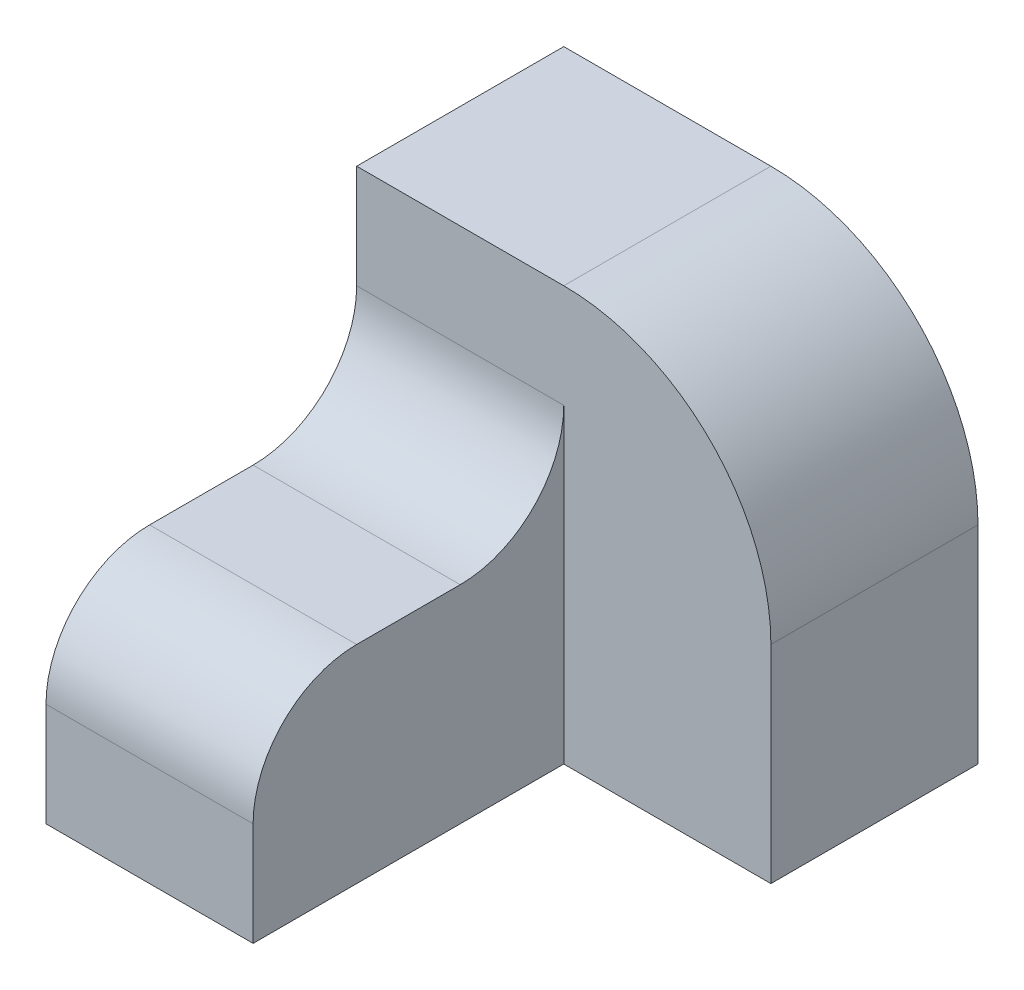
ISO-10303-21;
HEADER;
FILE_DESCRIPTION(('STEP AP214'),'2;1');
FILE_NAME('part.step','',(''),(''),'','','');
FILE_SCHEMA(('AUTOMOTIVE_DESIGN { 1 0 10303 214 1 1 1 1 }'));
ENDSEC;
DATA;
#1=APPLICATION_CONTEXT('core data for automotive mechanical design processes');
#2=APPLICATION_PROTOCOL_DEFINITION('international standard','automotive_design',2000,#1);
#3=PRODUCT_CONTEXT('',#1,'mechanical');
#4=PRODUCT('Part','Part','',(#3));
#5=PRODUCT_RELATED_PRODUCT_CATEGORY('part','',(#4));
#6=PRODUCT_DEFINITION_FORMATION('','',#4);
#7=PRODUCT_DEFINITION_CONTEXT('part definition',#1,'design');
#8=PRODUCT_DEFINITION('design','',#6,#7);
#9=PRODUCT_DEFINITION_SHAPE('','',#8);
#10=(LENGTH_UNIT() NAMED_UNIT(*) SI_UNIT(.MILLI.,.METRE.));
#11=(NAMED_UNIT(*) PLANE_ANGLE_UNIT() SI_UNIT($,.RADIAN.));
#12=(NAMED_UNIT(*) SI_UNIT($,.STERADIAN.) SOLID_ANGLE_UNIT());
#13=UNCERTAINTY_MEASURE_WITH_UNIT(LENGTH_MEASURE(1.E-05),#10,'distance_accuracy_value','');
#14=(GEOMETRIC_REPRESENTATION_CONTEXT(3) GLOBAL_UNCERTAINTY_ASSIGNED_CONTEXT((#13)) GLOBAL_UNIT_ASSIGNED_CONTEXT((#10,
#11,#12)) REPRESENTATION_CONTEXT('',''));
#15=CARTESIAN_POINT('',(0.,0.,0.));
#16=DIRECTION('',(0.,0.,1.));
#17=DIRECTION('',(1.,0.,0.));
#18=AXIS2_PLACEMENT_3D('',#15,#16,#17);
#19=CARTESIAN_POINT('',(0.,20.,0.));
#20=DIRECTION('',(0.,0.,-1.));
#21=DIRECTION('',(-1.,0.,0.));
#22=AXIS2_PLACEMENT_3D('',#19,#20,#21);
#23=PLANE('',#22);
#24=DIRECTION('',(0.,-1.,0.));
#25=VECTOR('',#24,1.);
#26=CARTESIAN_POINT('',(20.,20.,0.));
#27=LINE('',#26,#25);
#28=CARTESIAN_POINT('',(20.,10.,0.));
#29=VERTEX_POINT('',#28);
#30=CARTESIAN_POINT('',(20.,0.,0.));
#31=VERTEX_POINT('',#30);
#32=EDGE_CURVE('E166',#29,#31,#27,.T.);
#33=ORIENTED_EDGE('',*,*,#32,.F.);
#34=CARTESIAN_POINT('',(10.,10.,0.));
#35=DIRECTION('',(0.,0.,-1.));
#36=DIRECTION('',(-1.,0.,0.));
#37=AXIS2_PLACEMENT_3D('',#34,#35,#36);
#38=CIRCLE('',#37,10.);
#39=CARTESIAN_POINT('',(10.,20.,0.));
#40=VERTEX_POINT('',#39);
#41=EDGE_CURVE('E11',#29,#40,#38,.F.);
#42=ORIENTED_EDGE('',*,*,#41,.T.);
#43=DIRECTION('',(1.,0.,0.));
#44=VECTOR('',#43,1.);
#45=CARTESIAN_POINT('',(0.,20.,0.));
#46=LINE('',#45,#44);
#47=CARTESIAN_POINT('',(0.,20.,0.));
#48=VERTEX_POINT('',#47);
#49=EDGE_CURVE('E151',#48,#40,#46,.T.);
#50=ORIENTED_EDGE('',*,*,#49,.F.);
#51=DIRECTION('',(0.,-1.,0.));
#52=VECTOR('',#51,1.);
#53=CARTESIAN_POINT('',(0.,20.,0.));
#54=LINE('',#53,#52);
#55=CARTESIAN_POINT('',(0.,15.,0.));
#56=VERTEX_POINT('',#55);
#57=EDGE_CURVE('E168',#48,#56,#54,.T.);
#58=ORIENTED_EDGE('',*,*,#57,.T.);
#59=DIRECTION('',(-1.,0.,0.));
#60=VECTOR('',#59,1.);
#61=CARTESIAN_POINT('',(10.,15.,0.));
#62=LINE('',#61,#60);
#63=CARTESIAN_POINT('',(10.,15.,0.));
#64=VERTEX_POINT('',#63);
#65=EDGE_CURVE('E181',#56,#64,#62,.F.);
#66=ORIENTED_EDGE('',*,*,#65,.T.);
#67=DIRECTION('',(0.,1.,0.));
#68=VECTOR('',#67,1.);
#69=CARTESIAN_POINT('',(10.,0.,0.));
#70=LINE('',#69,#68);
#71=CARTESIAN_POINT('',(10.,0.,0.));
#72=VERTEX_POINT('',#71);
#73=EDGE_CURVE('E118',#72,#64,#70,.T.);
#74=ORIENTED_EDGE('',*,*,#73,.F.);
#75=DIRECTION('',(1.,0.,0.));
#76=VECTOR('',#75,1.);
#77=CARTESIAN_POINT('',(0.,0.,0.));
#78=LINE('',#77,#76);
#79=EDGE_CURVE('E129',#72,#31,#78,.T.);
#80=ORIENTED_EDGE('',*,*,#79,.T.);
#81=EDGE_LOOP('',(#33,#42,#50,#58,#66,#74,#80));
#82=FACE_BOUND('',#81,.T.);
#83=ADVANCED_FACE('F33',(#82),#23,.F.);
#84=CARTESIAN_POINT('',(0.,20.,0.));
#85=DIRECTION('',(1.,0.,0.));
#86=DIRECTION('',(0.,0.,-1.));
#87=AXIS2_PLACEMENT_3D('',#84,#85,#86);
#88=PLANE('',#87);
#89=DIRECTION('',(0.,-1.,0.));
#90=VECTOR('',#89,1.);
#91=CARTESIAN_POINT('',(0.,0.,15.));
#92=LINE('',#91,#90);
#93=CARTESIAN_POINT('',(0.,5.,15.));
#94=VERTEX_POINT('',#93);
#95=CARTESIAN_POINT('',(0.,0.,15.));
#96=VERTEX_POINT('',#95);
#97=EDGE_CURVE('E108',#94,#96,#92,.T.);
#98=ORIENTED_EDGE('',*,*,#97,.F.);
#99=CARTESIAN_POINT('',(0.,5.,10.));
#100=DIRECTION('',(1.,0.,0.));
#101=DIRECTION('',(0.,0.,-1.));
#102=AXIS2_PLACEMENT_3D('',#99,#100,#101);
#103=CIRCLE('',#102,5.);
#104=CARTESIAN_POINT('',(0.,10.,10.));
#105=VERTEX_POINT('',#104);
#106=EDGE_CURVE('E172',#94,#105,#103,.F.);
#107=ORIENTED_EDGE('',*,*,#106,.T.);
#108=DIRECTION('',(0.,0.,-1.));
#109=VECTOR('',#108,1.);
#110=CARTESIAN_POINT('',(0.,10.,15.));
#111=LINE('',#110,#109);
#112=CARTESIAN_POINT('',(0.,10.,5.));
#113=VERTEX_POINT('',#112);
#114=EDGE_CURVE('E138',#105,#113,#111,.T.);
#115=ORIENTED_EDGE('',*,*,#114,.T.);
#116=CARTESIAN_POINT('',(0.,15.,5.));
#117=DIRECTION('',(1.,0.,0.));
#118=DIRECTION('',(0.,0.,-1.));
#119=AXIS2_PLACEMENT_3D('',#116,#117,#118);
#120=CIRCLE('',#119,5.);
#121=EDGE_CURVE('E184',#113,#56,#120,.T.);
#122=ORIENTED_EDGE('',*,*,#121,.T.);
#123=ORIENTED_EDGE('',*,*,#57,.F.);
#124=DIRECTION('',(0.,0.,1.));
#125=VECTOR('',#124,1.);
#126=CARTESIAN_POINT('',(0.,20.,0.));
#127=LINE('',#126,#125);
#128=CARTESIAN_POINT('',(0.,20.,-10.));
#129=VERTEX_POINT('',#128);
#130=EDGE_CURVE('E148',#129,#48,#127,.T.);
#131=ORIENTED_EDGE('',*,*,#130,.F.);
#132=DIRECTION('',(0.,-1.,0.));
#133=VECTOR('',#132,1.);
#134=CARTESIAN_POINT('',(0.,20.,-10.));
#135=LINE('',#134,#133);
#136=CARTESIAN_POINT('',(0.,0.,-10.));
#137=VERTEX_POINT('',#136);
#138=EDGE_CURVE('E126',#129,#137,#135,.T.);
#139=ORIENTED_EDGE('',*,*,#138,.T.);
#140=DIRECTION('',(0.,0.,1.));
#141=VECTOR('',#140,1.);
#142=CARTESIAN_POINT('',(0.,0.,0.));
#143=LINE('',#142,#141);
#144=EDGE_CURVE('E122',#137,#96,#143,.T.);
#145=ORIENTED_EDGE('',*,*,#144,.T.);
#146=EDGE_LOOP('',(#98,#107,#115,#122,#123,#131,#139,#145));
#147=FACE_BOUND('',#146,.T.);
#148=ADVANCED_FACE('F123',(#147),#88,.F.);
#149=CARTESIAN_POINT('',(20.,20.,0.));
#150=DIRECTION('',(-1.,0.,0.));
#151=DIRECTION('',(0.,0.,1.));
#152=AXIS2_PLACEMENT_3D('',#149,#150,#151);
#153=PLANE('',#152);
#154=DIRECTION('',(0.,-1.,0.));
#155=VECTOR('',#154,1.);
#156=CARTESIAN_POINT('',(20.,20.,-10.));
#157=LINE('',#156,#155);
#158=CARTESIAN_POINT('',(20.,10.,-10.));
#159=VERTEX_POINT('',#158);
#160=CARTESIAN_POINT('',(20.,0.,-10.));
#161=VERTEX_POINT('',#160);
#162=EDGE_CURVE('E164',#159,#161,#157,.T.);
#163=ORIENTED_EDGE('',*,*,#162,.F.);
#164=DIRECTION('',(0.,0.,-1.));
#165=VECTOR('',#164,1.);
#166=CARTESIAN_POINT('',(20.,10.,0.));
#167=LINE('',#166,#165);
#168=EDGE_CURVE('E41',#159,#29,#167,.F.);
#169=ORIENTED_EDGE('',*,*,#168,.T.);
#170=ORIENTED_EDGE('',*,*,#32,.T.);
#171=DIRECTION('',(0.,0.,-1.));
#172=VECTOR('',#171,1.);
#173=CARTESIAN_POINT('',(20.,0.,0.));
#174=LINE('',#173,#172);
#175=EDGE_CURVE('E159',#31,#161,#174,.T.);
#176=ORIENTED_EDGE('',*,*,#175,.T.);
#177=EDGE_LOOP('',(#163,#169,#170,#176));
#178=FACE_BOUND('',#177,.T.);
#179=ADVANCED_FACE('F227',(#178),#153,.F.);
#180=CARTESIAN_POINT('',(0.,20.,-10.));
#181=DIRECTION('',(0.,0.,1.));
#182=DIRECTION('',(1.,0.,0.));
#183=AXIS2_PLACEMENT_3D('',#180,#181,#182);
#184=PLANE('',#183);
#185=DIRECTION('',(-1.,0.,0.));
#186=VECTOR('',#185,1.);
#187=CARTESIAN_POINT('',(0.,20.,-10.));
#188=LINE('',#187,#186);
#189=CARTESIAN_POINT('',(10.,20.,-10.));
#190=VERTEX_POINT('',#189);
#191=EDGE_CURVE('E155',#190,#129,#188,.T.);
#192=ORIENTED_EDGE('',*,*,#191,.F.);
#193=CARTESIAN_POINT('',(10.,10.,-10.));
#194=DIRECTION('',(0.,0.,1.));
#195=DIRECTION('',(1.,0.,0.));
#196=AXIS2_PLACEMENT_3D('',#193,#194,#195);
#197=CIRCLE('',#196,10.);
#198=EDGE_CURVE('E55',#190,#159,#197,.F.);
#199=ORIENTED_EDGE('',*,*,#198,.T.);
#200=ORIENTED_EDGE('',*,*,#162,.T.);
#201=DIRECTION('',(-1.,0.,0.));
#202=VECTOR('',#201,1.);
#203=CARTESIAN_POINT('',(0.,0.,-10.));
#204=LINE('',#203,#202);
#205=EDGE_CURVE('E152',#161,#137,#204,.T.);
#206=ORIENTED_EDGE('',*,*,#205,.T.);
#207=ORIENTED_EDGE('',*,*,#138,.F.);
#208=EDGE_LOOP('',(#192,#199,#200,#206,#207));
#209=FACE_BOUND('',#208,.T.);
#210=ADVANCED_FACE('F196',(#209),#184,.F.);
#211=CARTESIAN_POINT('',(0.,20.,0.));
#212=DIRECTION('',(0.,-1.,0.));
#213=DIRECTION('',(0.,0.,-1.));
#214=AXIS2_PLACEMENT_3D('',#211,#212,#213);
#215=PLANE('',#214);
#216=ORIENTED_EDGE('',*,*,#49,.T.);
#217=DIRECTION('',(0.,0.,-1.));
#218=VECTOR('',#217,1.);
#219=CARTESIAN_POINT('',(10.,20.,0.));
#220=LINE('',#219,#218);
#221=EDGE_CURVE('E188',#40,#190,#220,.T.);
#222=ORIENTED_EDGE('',*,*,#221,.T.);
#223=ORIENTED_EDGE('',*,*,#191,.T.);
#224=ORIENTED_EDGE('',*,*,#130,.T.);
#225=EDGE_LOOP('',(#216,#222,#223,#224));
#226=FACE_BOUND('',#225,.T.);
#227=ADVANCED_FACE('F193',(#226),#215,.F.);
#228=CARTESIAN_POINT('',(0.,0.,0.));
#229=DIRECTION('',(0.,-1.,0.));
#230=DIRECTION('',(0.,0.,-1.));
#231=AXIS2_PLACEMENT_3D('',#228,#229,#230);
#232=PLANE('',#231);
#233=ORIENTED_EDGE('',*,*,#144,.F.);
#234=ORIENTED_EDGE('',*,*,#205,.F.);
#235=ORIENTED_EDGE('',*,*,#175,.F.);
#236=ORIENTED_EDGE('',*,*,#79,.F.);
#237=DIRECTION('',(0.,0.,-1.));
#238=VECTOR('',#237,1.);
#239=CARTESIAN_POINT('',(10.,0.,15.));
#240=LINE('',#239,#238);
#241=CARTESIAN_POINT('',(10.,0.,15.));
#242=VERTEX_POINT('',#241);
#243=EDGE_CURVE('E130',#242,#72,#240,.T.);
#244=ORIENTED_EDGE('',*,*,#243,.F.);
#245=DIRECTION('',(1.,0.,0.));
#246=VECTOR('',#245,1.);
#247=CARTESIAN_POINT('',(0.,0.,15.));
#248=LINE('',#247,#246);
#249=EDGE_CURVE('E113',#96,#242,#248,.T.);
#250=ORIENTED_EDGE('',*,*,#249,.F.);
#251=EDGE_LOOP('',(#233,#234,#235,#236,#244,#250));
#252=FACE_BOUND('',#251,.T.);
#253=ADVANCED_FACE('F132',(#252),#232,.T.);
#254=CARTESIAN_POINT('',(10.,0.,15.));
#255=DIRECTION('',(-1.,0.,0.));
#256=DIRECTION('',(0.,-1.,0.));
#257=AXIS2_PLACEMENT_3D('',#254,#255,#256);
#258=PLANE('',#257);
#259=DIRECTION('',(0.,0.,-1.));
#260=VECTOR('',#259,1.);
#261=CARTESIAN_POINT('',(10.,10.,15.));
#262=LINE('',#261,#260);
#263=CARTESIAN_POINT('',(10.,10.,10.));
#264=VERTEX_POINT('',#263);
#265=CARTESIAN_POINT('',(10.,10.,5.));
#266=VERTEX_POINT('',#265);
#267=EDGE_CURVE('E144',#264,#266,#262,.T.);
#268=ORIENTED_EDGE('',*,*,#267,.F.);
#269=CARTESIAN_POINT('',(10.,5.,10.));
#270=DIRECTION('',(-1.,0.,0.));
#271=DIRECTION('',(0.,-1.,0.));
#272=AXIS2_PLACEMENT_3D('',#269,#270,#271);
#273=CIRCLE('',#272,5.);
#274=CARTESIAN_POINT('',(10.,5.,15.));
#275=VERTEX_POINT('',#274);
#276=EDGE_CURVE('E179',#264,#275,#273,.F.);
#277=ORIENTED_EDGE('',*,*,#276,.T.);
#278=DIRECTION('',(0.,1.,0.));
#279=VECTOR('',#278,1.);
#280=CARTESIAN_POINT('',(10.,0.,15.));
#281=LINE('',#280,#279);
#282=EDGE_CURVE('E136',#242,#275,#281,.T.);
#283=ORIENTED_EDGE('',*,*,#282,.F.);
#284=ORIENTED_EDGE('',*,*,#243,.T.);
#285=ORIENTED_EDGE('',*,*,#73,.T.);
#286=CARTESIAN_POINT('',(10.,15.,5.));
#287=DIRECTION('',(-1.,0.,0.));
#288=DIRECTION('',(0.,-1.,0.));
#289=AXIS2_PLACEMENT_3D('',#286,#287,#288);
#290=CIRCLE('',#289,5.);
#291=EDGE_CURVE('E186',#64,#266,#290,.T.);
#292=ORIENTED_EDGE('',*,*,#291,.T.);
#293=EDGE_LOOP('',(#268,#277,#283,#284,#285,#292));
#294=FACE_BOUND('',#293,.T.);
#295=ADVANCED_FACE('F206',(#294),#258,.F.);
#296=CARTESIAN_POINT('',(0.,10.,15.));
#297=DIRECTION('',(0.,-1.,0.));
#298=DIRECTION('',(0.,0.,-1.));
#299=AXIS2_PLACEMENT_3D('',#296,#297,#298);
#300=PLANE('',#299);
#301=ORIENTED_EDGE('',*,*,#114,.F.);
#302=DIRECTION('',(-1.,0.,0.));
#303=VECTOR('',#302,1.);
#304=CARTESIAN_POINT('',(0.,10.,10.));
#305=LINE('',#304,#303);
#306=EDGE_CURVE('E177',#105,#264,#305,.F.);
#307=ORIENTED_EDGE('',*,*,#306,.T.);
#308=ORIENTED_EDGE('',*,*,#267,.T.);
#309=DIRECTION('',(-1.,0.,0.));
#310=VECTOR('',#309,1.);
#311=CARTESIAN_POINT('',(0.,10.,5.));
#312=LINE('',#311,#310);
#313=EDGE_CURVE('E174',#266,#113,#312,.T.);
#314=ORIENTED_EDGE('',*,*,#313,.T.);
#315=EDGE_LOOP('',(#301,#307,#308,#314));
#316=FACE_BOUND('',#315,.T.);
#317=ADVANCED_FACE('F210',(#316),#300,.F.);
#318=CARTESIAN_POINT('',(0.,0.,15.));
#319=DIRECTION('',(0.,0.,-1.));
#320=DIRECTION('',(-1.,0.,0.));
#321=AXIS2_PLACEMENT_3D('',#318,#319,#320);
#322=PLANE('',#321);
#323=ORIENTED_EDGE('',*,*,#282,.T.);
#324=DIRECTION('',(-1.,0.,0.));
#325=VECTOR('',#324,1.);
#326=CARTESIAN_POINT('',(0.,5.,15.));
#327=LINE('',#326,#325);
#328=EDGE_CURVE('E116',#275,#94,#327,.T.);
#329=ORIENTED_EDGE('',*,*,#328,.T.);
#330=ORIENTED_EDGE('',*,*,#97,.T.);
#331=ORIENTED_EDGE('',*,*,#249,.T.);
#332=EDGE_LOOP('',(#323,#329,#330,#331));
#333=FACE_BOUND('',#332,.T.);
#334=ADVANCED_FACE('F111',(#333),#322,.F.);
#335=CARTESIAN_POINT('',(0.,5.,10.));
#336=DIRECTION('',(-1.,0.,0.));
#337=DIRECTION('',(0.,0.,1.));
#338=AXIS2_PLACEMENT_3D('',#335,#336,#337);
#339=CYLINDRICAL_SURFACE('',#338,5.);
#340=ORIENTED_EDGE('',*,*,#276,.F.);
#341=ORIENTED_EDGE('',*,*,#306,.F.);
#342=ORIENTED_EDGE('',*,*,#106,.F.);
#343=ORIENTED_EDGE('',*,*,#328,.F.);
#344=EDGE_LOOP('',(#340,#341,#342,#343));
#345=FACE_BOUND('',#344,.T.);
#346=ADVANCED_FACE('F213',(#345),#339,.T.);
#347=CARTESIAN_POINT('',(0.,15.,5.));
#348=DIRECTION('',(1.,0.,0.));
#349=DIRECTION('',(0.,0.,-1.));
#350=AXIS2_PLACEMENT_3D('',#347,#348,#349);
#351=CYLINDRICAL_SURFACE('',#350,5.);
#352=ORIENTED_EDGE('',*,*,#291,.F.);
#353=ORIENTED_EDGE('',*,*,#65,.F.);
#354=ORIENTED_EDGE('',*,*,#121,.F.);
#355=ORIENTED_EDGE('',*,*,#313,.F.);
#356=EDGE_LOOP('',(#352,#353,#354,#355));
#357=FACE_BOUND('',#356,.T.);
#358=ADVANCED_FACE('F202',(#357),#351,.F.);
#359=CARTESIAN_POINT('',(10.,10.,0.));
#360=DIRECTION('',(0.,0.,-1.));
#361=DIRECTION('',(-1.,0.,0.));
#362=AXIS2_PLACEMENT_3D('',#359,#360,#361);
#363=CYLINDRICAL_SURFACE('',#362,10.);
#364=ORIENTED_EDGE('',*,*,#41,.F.);
#365=ORIENTED_EDGE('',*,*,#168,.F.);
#366=ORIENTED_EDGE('',*,*,#198,.F.);
#367=ORIENTED_EDGE('',*,*,#221,.F.);
#368=EDGE_LOOP('',(#364,#365,#366,#367));
#369=FACE_BOUND('',#368,.T.);
#370=ADVANCED_FACE('F35',(#369),#363,.T.);
#371=CLOSED_SHELL('',(#83,#148,#179,#210,#227,#253,#295,#317,#334,#346,#358,#370));
#372=MANIFOLD_SOLID_BREP('B2',#371);
#373=ADVANCED_BREP_SHAPE_REPRESENTATION('',(#18,#372),#14);
#374=SHAPE_DEFINITION_REPRESENTATION(#9,#373);
ENDSEC;
END-ISO-10303-21;
